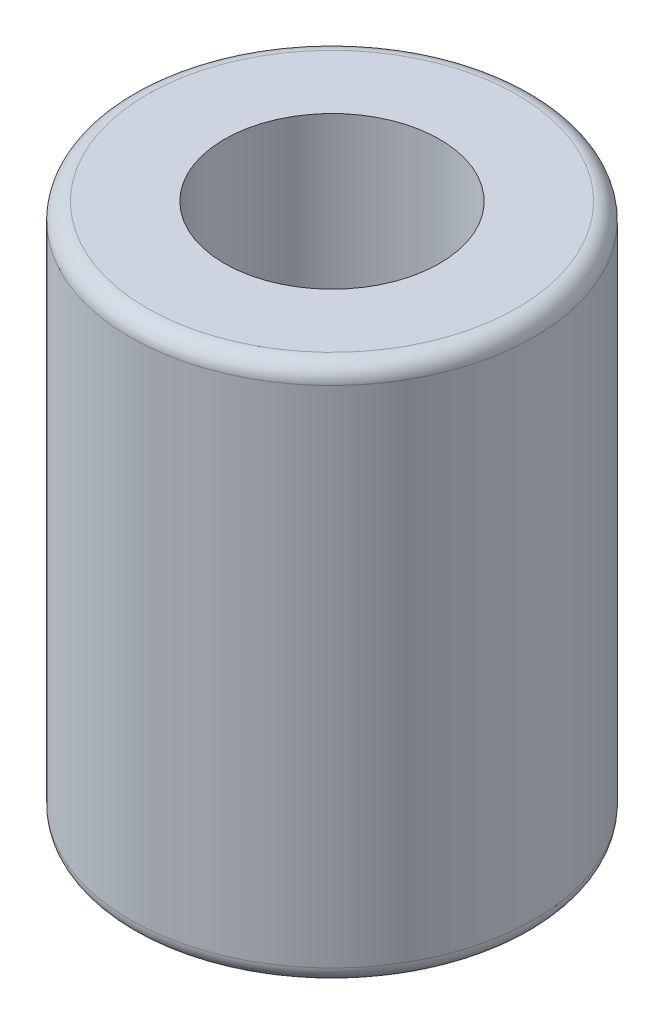
ISO-10303-21;
HEADER;
FILE_DESCRIPTION(('STEP AP214'),'2;1');
FILE_NAME('part.step','',(''),(''),'','','');
FILE_SCHEMA(('AUTOMOTIVE_DESIGN { 1 0 10303 214 1 1 1 1 }'));
ENDSEC;
DATA;
#1=APPLICATION_CONTEXT('core data for automotive mechanical design processes');
#2=APPLICATION_PROTOCOL_DEFINITION('international standard','automotive_design',2000,#1);
#3=PRODUCT_CONTEXT('',#1,'mechanical');
#4=PRODUCT('Part','Part','',(#3));
#5=PRODUCT_RELATED_PRODUCT_CATEGORY('part','',(#4));
#6=PRODUCT_DEFINITION_FORMATION('','',#4);
#7=PRODUCT_DEFINITION_CONTEXT('part definition',#1,'design');
#8=PRODUCT_DEFINITION('design','',#6,#7);
#9=PRODUCT_DEFINITION_SHAPE('','',#8);
#10=(LENGTH_UNIT() NAMED_UNIT(*) SI_UNIT(.MILLI.,.METRE.));
#11=(NAMED_UNIT(*) PLANE_ANGLE_UNIT() SI_UNIT($,.RADIAN.));
#12=(NAMED_UNIT(*) SI_UNIT($,.STERADIAN.) SOLID_ANGLE_UNIT());
#13=UNCERTAINTY_MEASURE_WITH_UNIT(LENGTH_MEASURE(1.E-05),#10,'distance_accuracy_value','');
#14=(GEOMETRIC_REPRESENTATION_CONTEXT(3) GLOBAL_UNCERTAINTY_ASSIGNED_CONTEXT((#13)) GLOBAL_UNIT_ASSIGNED_CONTEXT((#10,
#11,#12)) REPRESENTATION_CONTEXT('',''));
#15=CARTESIAN_POINT('',(0.,0.,0.));
#16=DIRECTION('',(0.,0.,1.));
#17=DIRECTION('',(1.,0.,0.));
#18=AXIS2_PLACEMENT_3D('',#15,#16,#17);
#19=CARTESIAN_POINT('',(0.,8.,0.));
#20=DIRECTION('',(0.,1.,0.));
#21=DIRECTION('',(0.,0.,1.));
#22=AXIS2_PLACEMENT_3D('',#19,#20,#21);
#23=PLANE('',#22);
#24=CARTESIAN_POINT('',(0.,8.,0.));
#25=DIRECTION('',(0.,1.,0.));
#26=DIRECTION('',(0.,0.,1.));
#27=AXIS2_PLACEMENT_3D('',#24,#25,#26);
#28=CIRCLE('',#27,2.75);
#29=CARTESIAN_POINT('',(0.,8.,2.75));
#30=VERTEX_POINT('',#29);
#31=EDGE_CURVE('E10',#30,#30,#28,.T.);
#32=ORIENTED_EDGE('',*,*,#31,.T.);
#33=EDGE_LOOP('',(#32));
#34=FACE_BOUND('',#33,.T.);
#35=CARTESIAN_POINT('',(0.,8.,0.));
#36=DIRECTION('',(0.,1.,0.));
#37=DIRECTION('',(0.,0.,1.));
#38=AXIS2_PLACEMENT_3D('',#35,#36,#37);
#39=CIRCLE('',#38,1.6);
#40=CARTESIAN_POINT('',(0.,8.,1.6));
#41=VERTEX_POINT('',#40);
#42=EDGE_CURVE('E50',#41,#41,#39,.T.);
#43=ORIENTED_EDGE('',*,*,#42,.F.);
#44=EDGE_LOOP('',(#43));
#45=FACE_BOUND('',#44,.T.);
#46=ADVANCED_FACE('F30',(#34,#45),#23,.T.);
#47=CARTESIAN_POINT('',(0.,0.,0.));
#48=DIRECTION('',(0.,1.,0.));
#49=DIRECTION('',(0.,0.,1.));
#50=AXIS2_PLACEMENT_3D('',#47,#48,#49);
#51=PLANE('',#50);
#52=CARTESIAN_POINT('',(0.,0.,0.));
#53=DIRECTION('',(0.,1.,0.));
#54=DIRECTION('',(0.,0.,1.));
#55=AXIS2_PLACEMENT_3D('',#52,#53,#54);
#56=CIRCLE('',#55,2.75);
#57=CARTESIAN_POINT('',(0.,0.,2.75));
#58=VERTEX_POINT('',#57);
#59=EDGE_CURVE('E37',#58,#58,#56,.F.);
#60=ORIENTED_EDGE('',*,*,#59,.T.);
#61=EDGE_LOOP('',(#60));
#62=FACE_BOUND('',#61,.T.);
#63=CARTESIAN_POINT('',(0.,0.,0.));
#64=DIRECTION('',(0.,1.,0.));
#65=DIRECTION('',(0.,0.,1.));
#66=AXIS2_PLACEMENT_3D('',#63,#64,#65);
#67=CIRCLE('',#66,1.6);
#68=CARTESIAN_POINT('',(0.,0.,1.6));
#69=VERTEX_POINT('',#68);
#70=EDGE_CURVE('E51',#69,#69,#67,.T.);
#71=ORIENTED_EDGE('',*,*,#70,.T.);
#72=EDGE_LOOP('',(#71));
#73=FACE_BOUND('',#72,.T.);
#74=ADVANCED_FACE('F61',(#62,#73),#51,.F.);
#75=CARTESIAN_POINT('',(0.,8.,0.));
#76=DIRECTION('',(0.,-1.,0.));
#77=DIRECTION('',(0.,0.,-1.));
#78=AXIS2_PLACEMENT_3D('',#75,#76,#77);
#79=CYLINDRICAL_SURFACE('',#78,3.);
#80=CARTESIAN_POINT('',(0.,0.25,0.));
#81=DIRECTION('',(0.,1.,0.));
#82=DIRECTION('',(0.,0.,1.));
#83=AXIS2_PLACEMENT_3D('',#80,#81,#82);
#84=CIRCLE('',#83,3.);
#85=CARTESIAN_POINT('',(0.,0.25,3.));
#86=VERTEX_POINT('',#85);
#87=EDGE_CURVE('E41',#86,#86,#84,.T.);
#88=ORIENTED_EDGE('',*,*,#87,.T.);
#89=EDGE_LOOP('',(#88));
#90=FACE_BOUND('',#89,.T.);
#91=CARTESIAN_POINT('',(0.,7.75,0.));
#92=DIRECTION('',(0.,1.,0.));
#93=DIRECTION('',(0.,0.,1.));
#94=AXIS2_PLACEMENT_3D('',#91,#92,#93);
#95=CIRCLE('',#94,3.);
#96=CARTESIAN_POINT('',(0.,7.75,3.));
#97=VERTEX_POINT('',#96);
#98=EDGE_CURVE('E45',#97,#97,#95,.F.);
#99=ORIENTED_EDGE('',*,*,#98,.T.);
#100=EDGE_LOOP('',(#99));
#101=FACE_BOUND('',#100,.T.);
#102=ADVANCED_FACE('F66',(#90,#101),#79,.T.);
#103=CARTESIAN_POINT('',(0.,8.,0.));
#104=DIRECTION('',(0.,-1.,0.));
#105=DIRECTION('',(0.,0.,-1.));
#106=AXIS2_PLACEMENT_3D('',#103,#104,#105);
#107=CYLINDRICAL_SURFACE('',#106,1.6);
#108=ORIENTED_EDGE('',*,*,#42,.T.);
#109=EDGE_LOOP('',(#108));
#110=FACE_BOUND('',#109,.T.);
#111=ORIENTED_EDGE('',*,*,#70,.F.);
#112=EDGE_LOOP('',(#111));
#113=FACE_BOUND('',#112,.T.);
#114=ADVANCED_FACE('F57',(#110,#113),#107,.F.);
#115=CARTESIAN_POINT('',(0.,0.25,0.));
#116=DIRECTION('',(0.,1.,0.));
#117=DIRECTION('',(0.,0.,1.));
#118=AXIS2_PLACEMENT_3D('',#115,#116,#117);
#119=TOROIDAL_SURFACE('',#118,2.75,0.25);
#120=ORIENTED_EDGE('',*,*,#59,.F.);
#121=EDGE_LOOP('',(#120));
#122=FACE_BOUND('',#121,.T.);
#123=ORIENTED_EDGE('',*,*,#87,.F.);
#124=EDGE_LOOP('',(#123));
#125=FACE_BOUND('',#124,.T.);
#126=ADVANCED_FACE('F72',(#122,#125),#119,.T.);
#127=CARTESIAN_POINT('',(0.,7.75,0.));
#128=DIRECTION('',(0.,1.,0.));
#129=DIRECTION('',(0.,0.,1.));
#130=AXIS2_PLACEMENT_3D('',#127,#128,#129);
#131=TOROIDAL_SURFACE('',#130,2.75,0.25);
#132=ORIENTED_EDGE('',*,*,#98,.F.);
#133=EDGE_LOOP('',(#132));
#134=FACE_BOUND('',#133,.T.);
#135=ORIENTED_EDGE('',*,*,#31,.F.);
#136=EDGE_LOOP('',(#135));
#137=FACE_BOUND('',#136,.T.);
#138=ADVANCED_FACE('F32',(#134,#137),#131,.T.);
#139=CLOSED_SHELL('',(#46,#74,#102,#114,#126,#138));
#140=MANIFOLD_SOLID_BREP('B2',#139);
#141=ADVANCED_BREP_SHAPE_REPRESENTATION('',(#18,#140),#14);
#142=SHAPE_DEFINITION_REPRESENTATION(#9,#141);
ENDSEC;
END-ISO-10303-21;
